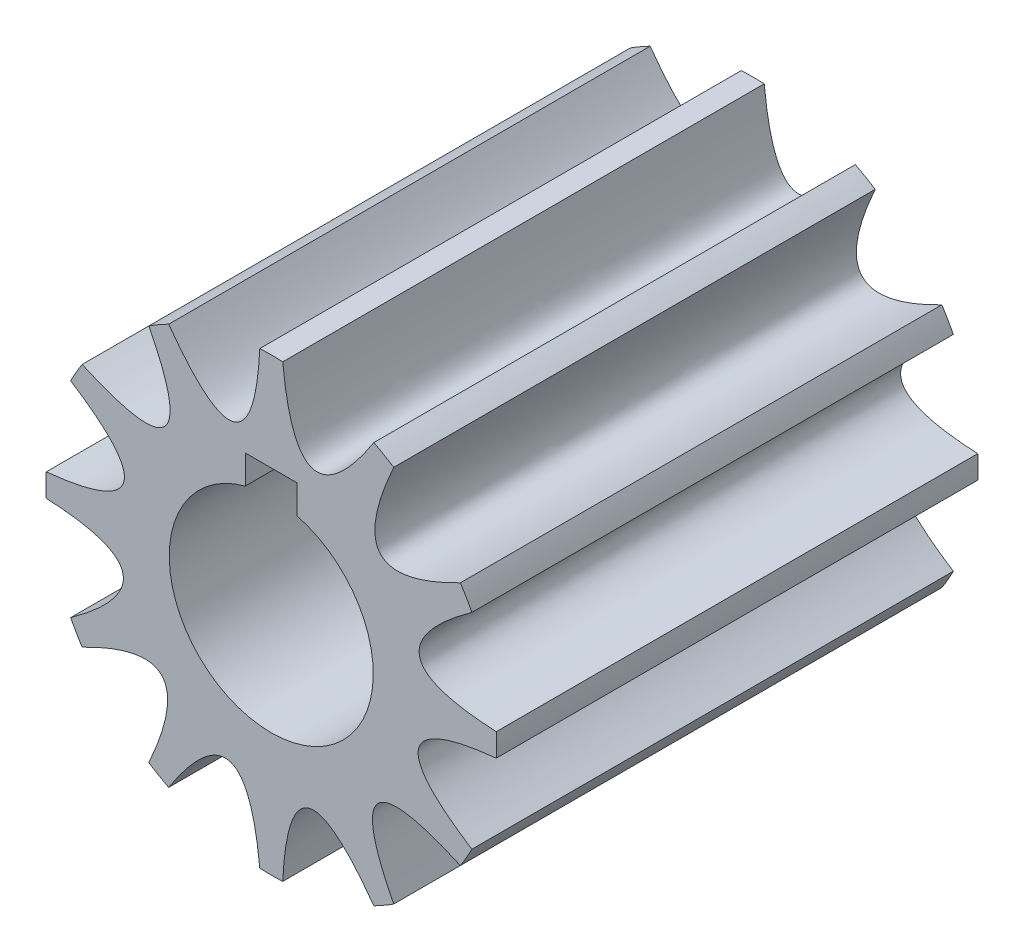
ISO-10303-21;
HEADER;
FILE_DESCRIPTION(('STEP AP214'),'2;1');
FILE_NAME('part.step','',(''),(''),'','','');
FILE_SCHEMA(('AUTOMOTIVE_DESIGN { 1 0 10303 214 1 1 1 1 }'));
ENDSEC;
DATA;
#1=APPLICATION_CONTEXT('core data for automotive mechanical design processes');
#2=APPLICATION_PROTOCOL_DEFINITION('international standard','automotive_design',2000,#1);
#3=PRODUCT_CONTEXT('',#1,'mechanical');
#4=PRODUCT('Part','Part','',(#3));
#5=PRODUCT_RELATED_PRODUCT_CATEGORY('part','',(#4));
#6=PRODUCT_DEFINITION_FORMATION('','',#4);
#7=PRODUCT_DEFINITION_CONTEXT('part definition',#1,'design');
#8=PRODUCT_DEFINITION('design','',#6,#7);
#9=PRODUCT_DEFINITION_SHAPE('','',#8);
#10=(LENGTH_UNIT() NAMED_UNIT(*) SI_UNIT(.MILLI.,.METRE.));
#11=(NAMED_UNIT(*) PLANE_ANGLE_UNIT() SI_UNIT($,.RADIAN.));
#12=(NAMED_UNIT(*) SI_UNIT($,.STERADIAN.) SOLID_ANGLE_UNIT());
#13=UNCERTAINTY_MEASURE_WITH_UNIT(LENGTH_MEASURE(1.E-05),#10,'distance_accuracy_value','');
#14=(GEOMETRIC_REPRESENTATION_CONTEXT(3) GLOBAL_UNCERTAINTY_ASSIGNED_CONTEXT((#13)) GLOBAL_UNIT_ASSIGNED_CONTEXT((#10,
#11,#12)) REPRESENTATION_CONTEXT('',''));
#15=CARTESIAN_POINT('',(0.,0.,0.));
#16=DIRECTION('',(0.,0.,1.));
#17=DIRECTION('',(1.,0.,0.));
#18=AXIS2_PLACEMENT_3D('',#15,#16,#17);
#19=CARTESIAN_POINT('',(48.4604558894753,203.448732204864,9.4996));
#20=DIRECTION('',(0.,0.,1.));
#21=DIRECTION('',(-0.230440532713317,-0.973086409771919,0.));
#22=AXIS2_PLACEMENT_3D('',#19,#20,#21);
#23=ELLIPSE('',#22,203.101376588858,11.5476272630597);
#24=DIRECTION('',(0.,0.,-1.));
#25=VECTOR('',#24,1.);
#26=SURFACE_OF_LINEAR_EXTRUSION('',#23,#25);
#27=CARTESIAN_POINT('',(48.4604558894753,203.448732204864,-9.4996));
#28=DIRECTION('',(0.,0.,1.));
#29=DIRECTION('',(-0.230440532713317,-0.973086409771919,0.));
#30=AXIS2_PLACEMENT_3D('',#27,#28,#29);
#31=ELLIPSE('',#30,203.101376588858,11.5476272630597);
#32=CARTESIAN_POINT('',(0.453195017414437,8.87844091143134,-9.4996));
#33=VERTEX_POINT('',#32);
#34=CARTESIAN_POINT('',(4.04674207822592,7.91555287445571,-9.4996));
#35=VERTEX_POINT('',#34);
#36=EDGE_CURVE('E253',#33,#35,#31,.T.);
#37=ORIENTED_EDGE('',*,*,#36,.F.);
#38=DIRECTION('',(0.,0.,-1.));
#39=VECTOR('',#38,1.);
#40=CARTESIAN_POINT('',(0.453195017414437,8.87844091143134,9.4996));
#41=LINE('',#40,#39);
#42=CARTESIAN_POINT('',(0.453195017414437,8.87844091143134,9.4996));
#43=VERTEX_POINT('',#42);
#44=EDGE_CURVE('E11',#43,#33,#41,.T.);
#45=ORIENTED_EDGE('',*,*,#44,.F.);
#46=CARTESIAN_POINT('',(4.04674207822592,7.91555287445571,9.4996));
#47=VERTEX_POINT('',#46);
#48=EDGE_CURVE('E256',#43,#47,#23,.T.);
#49=ORIENTED_EDGE('',*,*,#48,.T.);
#50=DIRECTION('',(0.,0.,-1.));
#51=VECTOR('',#50,1.);
#52=CARTESIAN_POINT('',(4.04674207822592,7.91555287445571,9.4996));
#53=LINE('',#52,#51);
#54=EDGE_CURVE('E38',#47,#35,#53,.T.);
#55=ORIENTED_EDGE('',*,*,#54,.T.);
#56=EDGE_LOOP('',(#37,#45,#49,#55));
#57=FACE_BOUND('',#56,.T.);
#58=ADVANCED_FACE('F34',(#57),#26,.T.);
#59=CARTESIAN_POINT('',(9.12772461780786E-10,-4.07165100246853E-09,9.4996));
#60=DIRECTION('',(0.,0.,-1.));
#61=DIRECTION('',(-1.,0.,0.));
#62=AXIS2_PLACEMENT_3D('',#59,#60,#61);
#63=CYLINDRICAL_SURFACE('',#62,8.88999993324295);
#64=CARTESIAN_POINT('',(9.12772461780786E-10,-4.07165100246853E-09,-9.4996));
#65=DIRECTION('',(0.,0.,-1.));
#66=DIRECTION('',(-1.,0.,0.));
#67=AXIS2_PLACEMENT_3D('',#64,#65,#66);
#68=CIRCLE('',#67,8.88999993324295);
#69=CARTESIAN_POINT('',(-0.453194988001726,8.87844091283965,-9.4996));
#70=VERTEX_POINT('',#69);
#71=EDGE_CURVE('E261',#70,#33,#68,.T.);
#72=ORIENTED_EDGE('',*,*,#71,.F.);
#73=DIRECTION('',(0.,0.,-1.));
#74=VECTOR('',#73,1.);
#75=CARTESIAN_POINT('',(-0.453194988001726,8.87844091283965,9.4996));
#76=LINE('',#75,#74);
#77=CARTESIAN_POINT('',(-0.453194988001726,8.87844091283965,9.4996));
#78=VERTEX_POINT('',#77);
#79=EDGE_CURVE('E43',#78,#70,#76,.T.);
#80=ORIENTED_EDGE('',*,*,#79,.F.);
#81=CARTESIAN_POINT('',(9.12772461780786E-10,-4.07165100246853E-09,9.4996));
#82=DIRECTION('',(0.,0.,-1.));
#83=DIRECTION('',(-1.,0.,0.));
#84=AXIS2_PLACEMENT_3D('',#81,#82,#83);
#85=CIRCLE('',#84,8.88999993324295);
#86=EDGE_CURVE('E355',#78,#43,#85,.T.);
#87=ORIENTED_EDGE('',*,*,#86,.T.);
#88=ORIENTED_EDGE('',*,*,#44,.T.);
#89=EDGE_LOOP('',(#72,#80,#87,#88));
#90=FACE_BOUND('',#89,.T.);
#91=ADVANCED_FACE('F287',(#90),#63,.T.);
#92=CARTESIAN_POINT('',(-59.7564548879514,200.422251397141,9.4996));
#93=DIRECTION('',(0.,0.,1.));
#94=DIRECTION('',(0.286975844333206,-0.95793781884277,0.));
#95=AXIS2_PLACEMENT_3D('',#92,#93,#94);
#96=ELLIPSE('',#95,203.10164036931,11.5476347448491);
#97=DIRECTION('',(0.,0.,-1.));
#98=VECTOR('',#97,1.);
#99=SURFACE_OF_LINEAR_EXTRUSION('',#96,#98);
#100=CARTESIAN_POINT('',(-59.7564548879514,200.422251397141,-9.4996));
#101=DIRECTION('',(0.,0.,1.));
#102=DIRECTION('',(0.286975844333206,-0.95793781884277,0.));
#103=AXIS2_PLACEMENT_3D('',#100,#101,#102);
#104=ELLIPSE('',#103,203.10164036931,11.5476347448491);
#105=CARTESIAN_POINT('',(-4.04674205967976,7.91555288300396,-9.4996));
#106=VERTEX_POINT('',#105);
#107=EDGE_CURVE('E307',#106,#70,#104,.T.);
#108=ORIENTED_EDGE('',*,*,#107,.F.);
#109=DIRECTION('',(0.,0.,-1.));
#110=VECTOR('',#109,1.);
#111=CARTESIAN_POINT('',(-4.04674205967976,7.91555288300396,9.4996));
#112=LINE('',#111,#110);
#113=CARTESIAN_POINT('',(-4.04674205967976,7.91555288300396,9.4996));
#114=VERTEX_POINT('',#113);
#115=EDGE_CURVE('E314',#114,#106,#112,.T.);
#116=ORIENTED_EDGE('',*,*,#115,.F.);
#117=EDGE_CURVE('E357',#114,#78,#96,.T.);
#118=ORIENTED_EDGE('',*,*,#117,.T.);
#119=ORIENTED_EDGE('',*,*,#79,.T.);
#120=EDGE_LOOP('',(#108,#116,#118,#119));
#121=FACE_BOUND('',#120,.T.);
#122=ADVANCED_FACE('F292',(#121),#99,.T.);
#123=CARTESIAN_POINT('',(9.12772461780786E-10,-4.07165100246853E-09,9.4996));
#124=DIRECTION('',(0.,0.,-1.));
#125=DIRECTION('',(-1.,0.,0.));
#126=AXIS2_PLACEMENT_3D('',#123,#124,#125);
#127=CYLINDRICAL_SURFACE('',#126,8.88999993324296);
#128=CARTESIAN_POINT('',(9.12772461780786E-10,-4.07165100246853E-09,-9.4996));
#129=DIRECTION('',(0.,0.,-1.));
#130=DIRECTION('',(-1.,0.,0.));
#131=AXIS2_PLACEMENT_3D('',#128,#129,#130);
#132=CIRCLE('',#131,8.88999993324296);
#133=CARTESIAN_POINT('',(-4.83169883081061,7.46235788151553,-9.4996));
#134=VERTEX_POINT('',#133);
#135=EDGE_CURVE('E309',#134,#106,#132,.T.);
#136=ORIENTED_EDGE('',*,*,#135,.F.);
#137=DIRECTION('',(0.,0.,-1.));
#138=VECTOR('',#137,1.);
#139=CARTESIAN_POINT('',(-4.83169883081061,7.46235788151553,9.4996));
#140=LINE('',#139,#138);
#141=CARTESIAN_POINT('',(-4.83169883081061,7.46235788151553,9.4996));
#142=VERTEX_POINT('',#141);
#143=EDGE_CURVE('E316',#142,#134,#140,.T.);
#144=ORIENTED_EDGE('',*,*,#143,.F.);
#145=CARTESIAN_POINT('',(9.12772461780786E-10,-4.07165100246853E-09,9.4996));
#146=DIRECTION('',(0.,0.,-1.));
#147=DIRECTION('',(-1.,0.,0.));
#148=AXIS2_PLACEMENT_3D('',#145,#146,#147);
#149=CIRCLE('',#148,8.88999993324296);
#150=EDGE_CURVE('E361',#142,#114,#149,.T.);
#151=ORIENTED_EDGE('',*,*,#150,.T.);
#152=ORIENTED_EDGE('',*,*,#115,.T.);
#153=EDGE_LOOP('',(#136,#144,#151,#152));
#154=FACE_BOUND('',#153,.T.);
#155=ADVANCED_FACE('F426',(#154),#127,.T.);
#156=CARTESIAN_POINT('',(-151.961676407504,143.692478593525,9.4996));
#157=DIRECTION('',(0.,0.,1.));
#158=DIRECTION('',(0.727497283751305,-0.686110561159404,0.));
#159=AXIS2_PLACEMENT_3D('',#156,#157,#158);
#160=ELLIPSE('',#159,203.101560866742,11.5476324964072);
#161=DIRECTION('',(0.,0.,-1.));
#162=VECTOR('',#161,1.);
#163=SURFACE_OF_LINEAR_EXTRUSION('',#160,#162);
#164=CARTESIAN_POINT('',(-151.961676407504,143.692478593525,-9.4996));
#165=DIRECTION('',(0.,0.,1.));
#166=DIRECTION('',(0.727497283751305,-0.686110561159404,0.));
#167=AXIS2_PLACEMENT_3D('',#164,#165,#166);
#168=ELLIPSE('',#167,203.101560866742,11.5476324964072);
#169=CARTESIAN_POINT('',(-7.46235786966115,4.8316988508388,-9.4996));
#170=VERTEX_POINT('',#169);
#171=EDGE_CURVE('E421',#170,#134,#168,.T.);
#172=ORIENTED_EDGE('',*,*,#171,.F.);
#173=DIRECTION('',(0.,0.,-1.));
#174=VECTOR('',#173,1.);
#175=CARTESIAN_POINT('',(-7.46235786966115,4.8316988508388,9.4996));
#176=LINE('',#175,#174);
#177=CARTESIAN_POINT('',(-7.46235786966115,4.8316988508388,9.4996));
#178=VERTEX_POINT('',#177);
#179=EDGE_CURVE('E318',#178,#170,#176,.T.);
#180=ORIENTED_EDGE('',*,*,#179,.F.);
#181=EDGE_CURVE('E532',#178,#142,#160,.T.);
#182=ORIENTED_EDGE('',*,*,#181,.T.);
#183=ORIENTED_EDGE('',*,*,#143,.T.);
#184=EDGE_LOOP('',(#172,#180,#182,#183));
#185=FACE_BOUND('',#184,.T.);
#186=ADVANCED_FACE('F531',(#185),#163,.T.);
#187=CARTESIAN_POINT('',(9.12772461780786E-10,-4.07165100246853E-09,9.4996));
#188=DIRECTION('',(0.,0.,-1.));
#189=DIRECTION('',(-1.,0.,0.));
#190=AXIS2_PLACEMENT_3D('',#187,#188,#189);
#191=CYLINDRICAL_SURFACE('',#190,8.88999993324295);
#192=CARTESIAN_POINT('',(9.12772461780786E-10,-4.07165100246853E-09,-9.4996));
#193=DIRECTION('',(0.,0.,-1.));
#194=DIRECTION('',(-1.,0.,0.));
#195=AXIS2_PLACEMENT_3D('',#192,#193,#194);
#196=CIRCLE('',#195,8.88999993324295);
#197=CARTESIAN_POINT('',(-7.91555287358883,4.04674208111627,-9.4996));
#198=VERTEX_POINT('',#197);
#199=EDGE_CURVE('E418',#198,#170,#196,.T.);
#200=ORIENTED_EDGE('',*,*,#199,.F.);
#201=DIRECTION('',(0.,0.,-1.));
#202=VECTOR('',#201,1.);
#203=CARTESIAN_POINT('',(-7.91555287358883,4.04674208111627,9.4996));
#204=LINE('',#203,#202);
#205=CARTESIAN_POINT('',(-7.91555287358883,4.04674208111627,9.4996));
#206=VERTEX_POINT('',#205);
#207=EDGE_CURVE('E320',#206,#198,#204,.T.);
#208=ORIENTED_EDGE('',*,*,#207,.F.);
#209=CARTESIAN_POINT('',(9.12772461780786E-10,-4.07165100246853E-09,9.4996));
#210=DIRECTION('',(0.,0.,-1.));
#211=DIRECTION('',(-1.,0.,0.));
#212=AXIS2_PLACEMENT_3D('',#209,#210,#211);
#213=CIRCLE('',#212,8.88999993324295);
#214=EDGE_CURVE('E527',#206,#178,#213,.T.);
#215=ORIENTED_EDGE('',*,*,#214,.T.);
#216=ORIENTED_EDGE('',*,*,#179,.T.);
#217=EDGE_LOOP('',(#200,#208,#215,#216));
#218=FACE_BOUND('',#217,.T.);
#219=ADVANCED_FACE('F526',(#218),#191,.T.);
#220=CARTESIAN_POINT('',(-203.448958796358,48.460510323592,9.4996));
#221=DIRECTION('',(0.,0.,1.));
#222=DIRECTION('',(0.97308640890236,-0.230440536385222,0.));
#223=AXIS2_PLACEMENT_3D('',#220,#221,#222);
#224=ELLIPSE('',#223,203.10160962351,11.5476338753159);
#225=DIRECTION('',(0.,0.,-1.));
#226=VECTOR('',#225,1.);
#227=SURFACE_OF_LINEAR_EXTRUSION('',#224,#226);
#228=CARTESIAN_POINT('',(-203.448958796358,48.460510323592,-9.4996));
#229=DIRECTION('',(0.,0.,1.));
#230=DIRECTION('',(0.97308640890236,-0.230440536385222,0.));
#231=AXIS2_PLACEMENT_3D('',#228,#229,#230);
#232=ELLIPSE('',#231,203.10160962351,11.5476338753159);
#233=CARTESIAN_POINT('',(-8.87844091459023,0.453195012430017,-9.4996));
#234=VERTEX_POINT('',#233);
#235=EDGE_CURVE('E415',#234,#198,#232,.T.);
#236=ORIENTED_EDGE('',*,*,#235,.F.);
#237=DIRECTION('',(0.,0.,-1.));
#238=VECTOR('',#237,1.);
#239=CARTESIAN_POINT('',(-8.87844091459023,0.453195012430017,9.4996));
#240=LINE('',#239,#238);
#241=CARTESIAN_POINT('',(-8.87844091459023,0.453195012430017,9.4996));
#242=VERTEX_POINT('',#241);
#243=EDGE_CURVE('E322',#242,#234,#240,.T.);
#244=ORIENTED_EDGE('',*,*,#243,.F.);
#245=EDGE_CURVE('E522',#242,#206,#224,.T.);
#246=ORIENTED_EDGE('',*,*,#245,.T.);
#247=ORIENTED_EDGE('',*,*,#207,.T.);
#248=EDGE_LOOP('',(#236,#244,#246,#247));
#249=FACE_BOUND('',#248,.T.);
#250=ADVANCED_FACE('F520',(#249),#227,.T.);
#251=CARTESIAN_POINT('',(9.12772461780786E-10,-4.07165100246853E-09,9.4996));
#252=DIRECTION('',(0.,0.,-1.));
#253=DIRECTION('',(-1.,0.,0.));
#254=AXIS2_PLACEMENT_3D('',#251,#252,#253);
#255=CYLINDRICAL_SURFACE('',#254,8.88999993324295);
#256=CARTESIAN_POINT('',(9.12772461780786E-10,-4.07165100246853E-09,-9.4996));
#257=DIRECTION('',(0.,0.,-1.));
#258=DIRECTION('',(-1.,0.,0.));
#259=AXIS2_PLACEMENT_3D('',#256,#257,#258);
#260=CIRCLE('',#259,8.88999993324295);
#261=CARTESIAN_POINT('',(-8.87844091599846,-0.453194992986183,-9.4996));
#262=VERTEX_POINT('',#261);
#263=EDGE_CURVE('E412',#262,#234,#260,.T.);
#264=ORIENTED_EDGE('',*,*,#263,.F.);
#265=DIRECTION('',(0.,0.,-1.));
#266=VECTOR('',#265,1.);
#267=CARTESIAN_POINT('',(-8.87844091599846,-0.453194992986183,9.4996));
#268=LINE('',#267,#266);
#269=CARTESIAN_POINT('',(-8.87844091599846,-0.453194992986183,9.4996));
#270=VERTEX_POINT('',#269);
#271=EDGE_CURVE('E324',#270,#262,#268,.T.);
#272=ORIENTED_EDGE('',*,*,#271,.F.);
#273=CARTESIAN_POINT('',(9.12772461780786E-10,-4.07165100246853E-09,9.4996));
#274=DIRECTION('',(0.,0.,-1.));
#275=DIRECTION('',(-1.,0.,0.));
#276=AXIS2_PLACEMENT_3D('',#273,#274,#275);
#277=CIRCLE('',#276,8.88999993324295);
#278=EDGE_CURVE('E516',#270,#242,#277,.T.);
#279=ORIENTED_EDGE('',*,*,#278,.T.);
#280=ORIENTED_EDGE('',*,*,#243,.T.);
#281=EDGE_LOOP('',(#264,#272,#279,#280));
#282=FACE_BOUND('',#281,.T.);
#283=ADVANCED_FACE('F513',(#282),#255,.T.);
#284=CARTESIAN_POINT('',(-200.422205243426,-59.75644159166,9.4996));
#285=DIRECTION('',(0.,0.,1.));
#286=DIRECTION('',(0.957937818118767,0.28697584674996,0.));
#287=AXIS2_PLACEMENT_3D('',#284,#285,#286);
#288=ELLIPSE('',#287,203.101592337243,11.5476333864361);
#289=DIRECTION('',(0.,0.,-1.));
#290=VECTOR('',#289,1.);
#291=SURFACE_OF_LINEAR_EXTRUSION('',#288,#290);
#292=CARTESIAN_POINT('',(-200.422205243426,-59.75644159166,-9.4996));
#293=DIRECTION('',(0.,0.,1.));
#294=DIRECTION('',(0.957937818118767,0.28697584674996,0.));
#295=AXIS2_PLACEMENT_3D('',#292,#293,#294);
#296=ELLIPSE('',#295,203.101592337243,11.5476333864361);
#297=CARTESIAN_POINT('',(-7.91555288616282,-4.04674206466421,-9.4996));
#298=VERTEX_POINT('',#297);
#299=EDGE_CURVE('E409',#298,#262,#296,.T.);
#300=ORIENTED_EDGE('',*,*,#299,.F.);
#301=DIRECTION('',(0.,0.,-1.));
#302=VECTOR('',#301,1.);
#303=CARTESIAN_POINT('',(-7.91555288616282,-4.04674206466421,9.4996));
#304=LINE('',#303,#302);
#305=CARTESIAN_POINT('',(-7.91555288616282,-4.04674206466421,9.4996));
#306=VERTEX_POINT('',#305);
#307=EDGE_CURVE('E326',#306,#298,#304,.T.);
#308=ORIENTED_EDGE('',*,*,#307,.F.);
#309=EDGE_CURVE('E550',#306,#270,#288,.T.);
#310=ORIENTED_EDGE('',*,*,#309,.T.);
#311=ORIENTED_EDGE('',*,*,#271,.T.);
#312=EDGE_LOOP('',(#300,#308,#310,#311));
#313=FACE_BOUND('',#312,.T.);
#314=ADVANCED_FACE('F509',(#313),#291,.T.);
#315=CARTESIAN_POINT('',(9.12772461780786E-10,-4.07165100246853E-09,9.4996));
#316=DIRECTION('',(0.,0.,-1.));
#317=DIRECTION('',(-1.,0.,0.));
#318=AXIS2_PLACEMENT_3D('',#315,#316,#317);
#319=CYLINDRICAL_SURFACE('',#318,8.88999993324294);
#320=CARTESIAN_POINT('',(9.12772461780786E-10,-4.07165100246853E-09,-9.4996));
#321=DIRECTION('',(0.,0.,-1.));
#322=DIRECTION('',(-1.,0.,0.));
#323=AXIS2_PLACEMENT_3D('',#320,#321,#322);
#324=CIRCLE('',#323,8.88999993324294);
#325=CARTESIAN_POINT('',(-7.46235788467428,-4.83169883579507,-9.4996));
#326=VERTEX_POINT('',#325);
#327=EDGE_CURVE('E406',#326,#298,#324,.T.);
#328=ORIENTED_EDGE('',*,*,#327,.F.);
#329=DIRECTION('',(0.,0.,-1.));
#330=VECTOR('',#329,1.);
#331=CARTESIAN_POINT('',(-7.46235788467428,-4.83169883579507,9.4996));
#332=LINE('',#331,#330);
#333=CARTESIAN_POINT('',(-7.46235788467428,-4.83169883579507,9.4996));
#334=VERTEX_POINT('',#333);
#335=EDGE_CURVE('E328',#334,#326,#332,.T.);
#336=ORIENTED_EDGE('',*,*,#335,.F.);
#337=CARTESIAN_POINT('',(9.12772461780786E-10,-4.07165100246853E-09,9.4996));
#338=DIRECTION('',(0.,0.,-1.));
#339=DIRECTION('',(-1.,0.,0.));
#340=AXIS2_PLACEMENT_3D('',#337,#338,#339);
#341=CIRCLE('',#340,8.88999993324294);
#342=EDGE_CURVE('E505',#334,#306,#341,.T.);
#343=ORIENTED_EDGE('',*,*,#342,.T.);
#344=ORIENTED_EDGE('',*,*,#307,.T.);
#345=EDGE_LOOP('',(#328,#336,#343,#344));
#346=FACE_BOUND('',#345,.T.);
#347=ADVANCED_FACE('F503',(#346),#319,.T.);
#348=CARTESIAN_POINT('',(-143.692499932456,-151.961698564761,9.4996));
#349=DIRECTION('',(0.,0.,1.));
#350=DIRECTION('',(-0.686110562334691,-0.72749728264288,0.));
#351=AXIS2_PLACEMENT_3D('',#348,#349,#350);
#352=ELLIPSE('',#351,203.101591620843,11.5476333661757);
#353=DIRECTION('',(0.,0.,-1.));
#354=VECTOR('',#353,1.);
#355=SURFACE_OF_LINEAR_EXTRUSION('',#352,#354);
#356=CARTESIAN_POINT('',(-143.692499932456,-151.961698564761,-9.4996));
#357=DIRECTION('',(0.,0.,1.));
#358=DIRECTION('',(-0.686110562334691,-0.72749728264288,0.));
#359=AXIS2_PLACEMENT_3D('',#356,#357,#358);
#360=ELLIPSE('',#359,203.101591620843,11.5476333661757);
#361=CARTESIAN_POINT('',(-4.83169885399765,-7.4623578746456,-9.4996));
#362=VERTEX_POINT('',#361);
#363=EDGE_CURVE('E403',#362,#326,#360,.T.);
#364=ORIENTED_EDGE('',*,*,#363,.F.);
#365=DIRECTION('',(0.,0.,-1.));
#366=VECTOR('',#365,1.);
#367=CARTESIAN_POINT('',(-4.83169885399765,-7.4623578746456,9.4996));
#368=LINE('',#367,#366);
#369=CARTESIAN_POINT('',(-4.83169885399765,-7.4623578746456,9.4996));
#370=VERTEX_POINT('',#369);
#371=EDGE_CURVE('E330',#370,#362,#368,.T.);
#372=ORIENTED_EDGE('',*,*,#371,.F.);
#373=EDGE_CURVE('E499',#370,#334,#352,.T.);
#374=ORIENTED_EDGE('',*,*,#373,.T.);
#375=ORIENTED_EDGE('',*,*,#335,.T.);
#376=EDGE_LOOP('',(#364,#372,#374,#375));
#377=FACE_BOUND('',#376,.T.);
#378=ADVANCED_FACE('F496',(#377),#355,.T.);
#379=CARTESIAN_POINT('',(9.12772461780786E-10,-4.07165100246853E-09,9.4996));
#380=DIRECTION('',(0.,0.,-1.));
#381=DIRECTION('',(-1.,0.,0.));
#382=AXIS2_PLACEMENT_3D('',#379,#380,#381);
#383=CYLINDRICAL_SURFACE('',#382,8.88999993324295);
#384=CARTESIAN_POINT('',(9.12772461780786E-10,-4.07165100246853E-09,-9.4996));
#385=DIRECTION('',(0.,0.,-1.));
#386=DIRECTION('',(-1.,0.,0.));
#387=AXIS2_PLACEMENT_3D('',#384,#385,#386);
#388=CIRCLE('',#387,8.88999993324295);
#389=CARTESIAN_POINT('',(-4.04674208427507,-7.91555287857329,-9.4996));
#390=VERTEX_POINT('',#389);
#391=EDGE_CURVE('E400',#390,#362,#388,.T.);
#392=ORIENTED_EDGE('',*,*,#391,.F.);
#393=DIRECTION('',(0.,0.,-1.));
#394=VECTOR('',#393,1.);
#395=CARTESIAN_POINT('',(-4.04674208427507,-7.91555287857329,9.4996));
#396=LINE('',#395,#394);
#397=CARTESIAN_POINT('',(-4.04674208427507,-7.91555287857329,9.4996));
#398=VERTEX_POINT('',#397);
#399=EDGE_CURVE('E332',#398,#390,#396,.T.);
#400=ORIENTED_EDGE('',*,*,#399,.F.);
#401=CARTESIAN_POINT('',(9.12772461780786E-10,-4.07165100246853E-09,9.4996));
#402=DIRECTION('',(0.,0.,-1.));
#403=DIRECTION('',(-1.,0.,0.));
#404=AXIS2_PLACEMENT_3D('',#401,#402,#403);
#405=CIRCLE('',#404,8.88999993324295);
#406=EDGE_CURVE('E563',#398,#370,#405,.T.);
#407=ORIENTED_EDGE('',*,*,#406,.T.);
#408=ORIENTED_EDGE('',*,*,#371,.T.);
#409=EDGE_LOOP('',(#392,#400,#407,#408));
#410=FACE_BOUND('',#409,.T.);
#411=ADVANCED_FACE('F492',(#410),#383,.T.);
#412=CARTESIAN_POINT('',(-48.4605160439241,-203.448981861526,9.4996));
#413=DIRECTION('',(0.,0.,1.));
#414=DIRECTION('',(-0.230440537599297,-0.97308640861485,0.));
#415=AXIS2_PLACEMENT_3D('',#412,#413,#414);
#416=ELLIPSE('',#415,203.101633380286,11.5476345471901);
#417=DIRECTION('',(0.,0.,-1.));
#418=VECTOR('',#417,1.);
#419=SURFACE_OF_LINEAR_EXTRUSION('',#416,#418);
#420=CARTESIAN_POINT('',(-48.4605160439241,-203.448981861526,-9.4996));
#421=DIRECTION('',(0.,0.,1.));
#422=DIRECTION('',(-0.230440537599297,-0.97308640861485,0.));
#423=AXIS2_PLACEMENT_3D('',#420,#421,#422);
#424=ELLIPSE('',#423,203.101633380286,11.5476345471901);
#425=CARTESIAN_POINT('',(-0.453195015588863,-8.87844091957467,-9.4996));
#426=VERTEX_POINT('',#425);
#427=EDGE_CURVE('E397',#426,#390,#424,.T.);
#428=ORIENTED_EDGE('',*,*,#427,.F.);
#429=DIRECTION('',(0.,0.,-1.));
#430=VECTOR('',#429,1.);
#431=CARTESIAN_POINT('',(-0.453195015588863,-8.87844091957467,9.4996));
#432=LINE('',#431,#430);
#433=CARTESIAN_POINT('',(-0.453195015588863,-8.87844091957467,9.4996));
#434=VERTEX_POINT('',#433);
#435=EDGE_CURVE('E334',#434,#426,#432,.T.);
#436=ORIENTED_EDGE('',*,*,#435,.F.);
#437=EDGE_CURVE('E488',#434,#398,#416,.T.);
#438=ORIENTED_EDGE('',*,*,#437,.T.);
#439=ORIENTED_EDGE('',*,*,#399,.T.);
#440=EDGE_LOOP('',(#428,#436,#438,#439));
#441=FACE_BOUND('',#440,.T.);
#442=ADVANCED_FACE('F486',(#441),#419,.T.);
#443=CARTESIAN_POINT('',(9.12772461780786E-10,-4.07165100246853E-09,9.4996));
#444=DIRECTION('',(0.,0.,-1.));
#445=DIRECTION('',(-1.,0.,0.));
#446=AXIS2_PLACEMENT_3D('',#443,#444,#445);
#447=CYLINDRICAL_SURFACE('',#446,8.88999993324297);
#448=CARTESIAN_POINT('',(9.12772461780786E-10,-4.07165100246853E-09,-9.4996));
#449=DIRECTION('',(0.,0.,-1.));
#450=DIRECTION('',(-1.,0.,0.));
#451=AXIS2_PLACEMENT_3D('',#448,#449,#450);
#452=CIRCLE('',#451,8.88999993324297);
#453=CARTESIAN_POINT('',(0.453194989827307,-8.87844092098297,-9.4996));
#454=VERTEX_POINT('',#453);
#455=EDGE_CURVE('E394',#454,#426,#452,.T.);
#456=ORIENTED_EDGE('',*,*,#455,.F.);
#457=DIRECTION('',(0.,0.,-1.));
#458=VECTOR('',#457,1.);
#459=CARTESIAN_POINT('',(0.453194989827307,-8.87844092098297,9.4996));
#460=LINE('',#459,#458);
#461=CARTESIAN_POINT('',(0.453194989827307,-8.87844092098297,9.4996));
#462=VERTEX_POINT('',#461);
#463=EDGE_CURVE('E336',#462,#454,#460,.T.);
#464=ORIENTED_EDGE('',*,*,#463,.F.);
#465=CARTESIAN_POINT('',(9.12772461780786E-10,-4.07165100246853E-09,9.4996));
#466=DIRECTION('',(0.,0.,-1.));
#467=DIRECTION('',(-1.,0.,0.));
#468=AXIS2_PLACEMENT_3D('',#465,#466,#467);
#469=CIRCLE('',#468,8.88999993324297);
#470=EDGE_CURVE('E482',#462,#434,#469,.T.);
#471=ORIENTED_EDGE('',*,*,#470,.T.);
#472=ORIENTED_EDGE('',*,*,#435,.T.);
#473=EDGE_LOOP('',(#456,#464,#471,#472));
#474=FACE_BOUND('',#473,.T.);
#475=ADVANCED_FACE('F479',(#474),#447,.T.);
#476=CARTESIAN_POINT('',(59.7564369931577,-200.422189302031,9.4996));
#477=DIRECTION('',(0.,0.,1.));
#478=DIRECTION('',(0.286975847584956,-0.957937817868621,0.));
#479=AXIS2_PLACEMENT_3D('',#476,#477,#478);
#480=ELLIPSE('',#479,203.10157574302,11.5476329171286);
#481=DIRECTION('',(0.,0.,-1.));
#482=VECTOR('',#481,1.);
#483=SURFACE_OF_LINEAR_EXTRUSION('',#480,#482);
#484=CARTESIAN_POINT('',(59.7564369931577,-200.422189302031,-9.4996));
#485=DIRECTION('',(0.,0.,1.));
#486=DIRECTION('',(0.286975847584956,-0.957937817868621,0.));
#487=AXIS2_PLACEMENT_3D('',#484,#485,#486);
#488=ELLIPSE('',#487,203.10157574302,11.5476329171286);
#489=CARTESIAN_POINT('',(4.04674206150534,-7.91555289114722,-9.4996));
#490=VERTEX_POINT('',#489);
#491=EDGE_CURVE('E391',#490,#454,#488,.T.);
#492=ORIENTED_EDGE('',*,*,#491,.F.);
#493=DIRECTION('',(0.,0.,-1.));
#494=VECTOR('',#493,1.);
#495=CARTESIAN_POINT('',(4.04674206150534,-7.91555289114722,9.4996));
#496=LINE('',#495,#494);
#497=CARTESIAN_POINT('',(4.04674206150534,-7.91555289114722,9.4996));
#498=VERTEX_POINT('',#497);
#499=EDGE_CURVE('E338',#498,#490,#496,.T.);
#500=ORIENTED_EDGE('',*,*,#499,.F.);
#501=EDGE_CURVE('E575',#498,#462,#480,.T.);
#502=ORIENTED_EDGE('',*,*,#501,.T.);
#503=ORIENTED_EDGE('',*,*,#463,.T.);
#504=EDGE_LOOP('',(#492,#500,#502,#503));
#505=FACE_BOUND('',#504,.T.);
#506=ADVANCED_FACE('F475',(#505),#483,.T.);
#507=CARTESIAN_POINT('',(9.12772461780786E-10,-4.07165100246853E-09,9.4996));
#508=DIRECTION('',(0.,0.,-1.));
#509=DIRECTION('',(-1.,0.,0.));
#510=AXIS2_PLACEMENT_3D('',#507,#508,#509);
#511=CYLINDRICAL_SURFACE('',#510,8.88999993324294);
#512=CARTESIAN_POINT('',(9.12772461780786E-10,-4.07165100246853E-09,-9.4996));
#513=DIRECTION('',(0.,0.,-1.));
#514=DIRECTION('',(-1.,0.,0.));
#515=AXIS2_PLACEMENT_3D('',#512,#513,#514);
#516=CIRCLE('',#515,8.88999993324294);
#517=CARTESIAN_POINT('',(4.83169883263626,-7.46235788965868,-9.4996));
#518=VERTEX_POINT('',#517);
#519=EDGE_CURVE('E388',#518,#490,#516,.T.);
#520=ORIENTED_EDGE('',*,*,#519,.F.);
#521=DIRECTION('',(0.,0.,-1.));
#522=VECTOR('',#521,1.);
#523=CARTESIAN_POINT('',(4.83169883263626,-7.46235788965868,9.4996));
#524=LINE('',#523,#522);
#525=CARTESIAN_POINT('',(4.83169883263626,-7.46235788965868,9.4996));
#526=VERTEX_POINT('',#525);
#527=EDGE_CURVE('E340',#526,#518,#524,.T.);
#528=ORIENTED_EDGE('',*,*,#527,.F.);
#529=CARTESIAN_POINT('',(9.12772461780786E-10,-4.07165100246853E-09,9.4996));
#530=DIRECTION('',(0.,0.,-1.));
#531=DIRECTION('',(-1.,0.,0.));
#532=AXIS2_PLACEMENT_3D('',#529,#530,#531);
#533=CIRCLE('',#532,8.88999993324294);
#534=EDGE_CURVE('E471',#526,#498,#533,.T.);
#535=ORIENTED_EDGE('',*,*,#534,.T.);
#536=ORIENTED_EDGE('',*,*,#499,.T.);
#537=EDGE_LOOP('',(#520,#528,#535,#536));
#538=FACE_BOUND('',#537,.T.);
#539=ADVANCED_FACE('F469',(#538),#511,.T.);
#540=CARTESIAN_POINT('',(151.961718141521,-143.692518795393,9.4996));
#541=DIRECTION('',(0.,0.,1.));
#542=DIRECTION('',(0.727497281663865,-0.686110563372761,0.));
#543=AXIS2_PLACEMENT_3D('',#540,#541,#542);
#544=ELLIPSE('',#543,203.101618803543,11.5476341349392);
#545=DIRECTION('',(0.,0.,-1.));
#546=VECTOR('',#545,1.);
#547=SURFACE_OF_LINEAR_EXTRUSION('',#544,#546);
#548=CARTESIAN_POINT('',(151.961718141521,-143.692518795393,-9.4996));
#549=DIRECTION('',(0.,0.,1.));
#550=DIRECTION('',(0.727497281663865,-0.686110563372761,0.));
#551=AXIS2_PLACEMENT_3D('',#548,#549,#550);
#552=ELLIPSE('',#551,203.101618803543,11.5476341349392);
#553=CARTESIAN_POINT('',(7.46235787148672,-4.83169885898208,-9.4996));
#554=VERTEX_POINT('',#553);
#555=EDGE_CURVE('E385',#554,#518,#552,.T.);
#556=ORIENTED_EDGE('',*,*,#555,.F.);
#557=DIRECTION('',(0.,0.,-1.));
#558=VECTOR('',#557,1.);
#559=CARTESIAN_POINT('',(7.46235787148672,-4.83169885898208,9.4996));
#560=LINE('',#559,#558);
#561=CARTESIAN_POINT('',(7.46235787148672,-4.83169885898208,9.4996));
#562=VERTEX_POINT('',#561);
#563=EDGE_CURVE('E342',#562,#554,#560,.T.);
#564=ORIENTED_EDGE('',*,*,#563,.F.);
#565=EDGE_CURVE('E465',#562,#526,#544,.T.);
#566=ORIENTED_EDGE('',*,*,#565,.T.);
#567=ORIENTED_EDGE('',*,*,#527,.T.);
#568=EDGE_LOOP('',(#556,#564,#566,#567));
#569=FACE_BOUND('',#568,.T.);
#570=ADVANCED_FACE('F462',(#569),#547,.T.);
#571=CARTESIAN_POINT('',(9.12772461780786E-10,-4.07165100246853E-09,9.4996));
#572=DIRECTION('',(0.,0.,-1.));
#573=DIRECTION('',(-1.,0.,0.));
#574=AXIS2_PLACEMENT_3D('',#571,#572,#573);
#575=CYLINDRICAL_SURFACE('',#574,8.88999993324295);
#576=CARTESIAN_POINT('',(9.12772461780786E-10,-4.07165100246853E-09,-9.4996));
#577=DIRECTION('',(0.,0.,-1.));
#578=DIRECTION('',(-1.,0.,0.));
#579=AXIS2_PLACEMENT_3D('',#576,#577,#578);
#580=CIRCLE('',#579,8.88999993324295);
#581=CARTESIAN_POINT('',(7.91555287541446,-4.04674208925947,-9.4996));
#582=VERTEX_POINT('',#581);
#583=EDGE_CURVE('E382',#582,#554,#580,.T.);
#584=ORIENTED_EDGE('',*,*,#583,.F.);
#585=DIRECTION('',(0.,0.,-1.));
#586=VECTOR('',#585,1.);
#587=CARTESIAN_POINT('',(7.91555287541446,-4.04674208925947,9.4996));
#588=LINE('',#587,#586);
#589=CARTESIAN_POINT('',(7.91555287541446,-4.04674208925947,9.4996));
#590=VERTEX_POINT('',#589);
#591=EDGE_CURVE('E344',#590,#582,#588,.T.);
#592=ORIENTED_EDGE('',*,*,#591,.F.);
#593=CARTESIAN_POINT('',(9.12772461780786E-10,-4.07165100246853E-09,9.4996));
#594=DIRECTION('',(0.,0.,-1.));
#595=DIRECTION('',(-1.,0.,0.));
#596=AXIS2_PLACEMENT_3D('',#593,#594,#595);
#597=CIRCLE('',#596,8.88999993324295);
#598=EDGE_CURVE('E581',#590,#562,#597,.T.);
#599=ORIENTED_EDGE('',*,*,#598,.T.);
#600=ORIENTED_EDGE('',*,*,#563,.T.);
#601=EDGE_LOOP('',(#584,#592,#599,#600));
#602=FACE_BOUND('',#601,.T.);
#603=ADVANCED_FACE('F458',(#602),#575,.T.);
#604=CARTESIAN_POINT('',(203.448989817863,-48.4605180220952,9.4996));
#605=DIRECTION('',(0.,0.,1.));
#606=DIRECTION('',(0.973086408515796,-0.230440538017576,0.));
#607=AXIS2_PLACEMENT_3D('',#604,#605,#606);
#608=ELLIPSE('',#607,203.101641580181,11.5476347790937);
#609=DIRECTION('',(0.,0.,-1.));
#610=VECTOR('',#609,1.);
#611=SURFACE_OF_LINEAR_EXTRUSION('',#608,#610);
#612=CARTESIAN_POINT('',(203.448989817863,-48.4605180220952,-9.4996));
#613=DIRECTION('',(0.,0.,1.));
#614=DIRECTION('',(0.973086408515796,-0.230440538017576,0.));
#615=AXIS2_PLACEMENT_3D('',#612,#613,#614);
#616=ELLIPSE('',#615,203.101641580181,11.5476347790937);
#617=CARTESIAN_POINT('',(8.87844091641576,-0.453195020573293,-9.4996));
#618=VERTEX_POINT('',#617);
#619=EDGE_CURVE('E379',#618,#582,#616,.T.);
#620=ORIENTED_EDGE('',*,*,#619,.F.);
#621=DIRECTION('',(0.,0.,-1.));
#622=VECTOR('',#621,1.);
#623=CARTESIAN_POINT('',(8.87844091641576,-0.453195020573293,9.4996));
#624=LINE('',#623,#622);
#625=CARTESIAN_POINT('',(8.87844091641576,-0.453195020573293,9.4996));
#626=VERTEX_POINT('',#625);
#627=EDGE_CURVE('E346',#626,#618,#624,.T.);
#628=ORIENTED_EDGE('',*,*,#627,.F.);
#629=EDGE_CURVE('E454',#626,#590,#608,.T.);
#630=ORIENTED_EDGE('',*,*,#629,.T.);
#631=ORIENTED_EDGE('',*,*,#591,.T.);
#632=EDGE_LOOP('',(#620,#628,#630,#631));
#633=FACE_BOUND('',#632,.T.);
#634=ADVANCED_FACE('F452',(#633),#611,.T.);
#635=CARTESIAN_POINT('',(9.12772461780786E-10,-4.07165100246853E-09,9.4996));
#636=DIRECTION('',(0.,0.,-1.));
#637=DIRECTION('',(-1.,0.,0.));
#638=AXIS2_PLACEMENT_3D('',#635,#636,#637);
#639=CYLINDRICAL_SURFACE('',#638,8.88999993324294);
#640=CARTESIAN_POINT('',(9.12772461780786E-10,-4.07165100246853E-09,-9.4996));
#641=DIRECTION('',(0.,0.,-1.));
#642=DIRECTION('',(-1.,0.,0.));
#643=AXIS2_PLACEMENT_3D('',#640,#641,#642);
#644=CIRCLE('',#643,8.88999993324294);
#645=CARTESIAN_POINT('',(8.87844091782403,0.453194984842899,-9.4996));
#646=VERTEX_POINT('',#645);
#647=EDGE_CURVE('E376',#646,#618,#644,.T.);
#648=ORIENTED_EDGE('',*,*,#647,.F.);
#649=DIRECTION('',(0.,0.,-1.));
#650=VECTOR('',#649,1.);
#651=CARTESIAN_POINT('',(8.87844091782403,0.453194984842899,9.4996));
#652=LINE('',#651,#650);
#653=CARTESIAN_POINT('',(8.87844091782403,0.453194984842899,9.4996));
#654=VERTEX_POINT('',#653);
#655=EDGE_CURVE('E348',#654,#646,#652,.T.);
#656=ORIENTED_EDGE('',*,*,#655,.F.);
#657=CARTESIAN_POINT('',(9.12772461780786E-10,-4.07165100246853E-09,9.4996));
#658=DIRECTION('',(0.,0.,-1.));
#659=DIRECTION('',(-1.,0.,0.));
#660=AXIS2_PLACEMENT_3D('',#657,#658,#659);
#661=CIRCLE('',#660,8.88999993324294);
#662=EDGE_CURVE('E448',#654,#626,#661,.T.);
#663=ORIENTED_EDGE('',*,*,#662,.T.);
#664=ORIENTED_EDGE('',*,*,#627,.T.);
#665=EDGE_LOOP('',(#648,#656,#663,#664));
#666=FACE_BOUND('',#665,.T.);
#667=ADVANCED_FACE('F445',(#666),#639,.T.);
#668=CARTESIAN_POINT('',(200.422228277713,59.7564482208918,9.4996));
#669=DIRECTION('',(0.,0.,1.));
#670=DIRECTION('',(0.957937818480067,0.286975845543926,0.));
#671=AXIS2_PLACEMENT_3D('',#668,#669,#670);
#672=ELLIPSE('',#671,203.101616305429,11.5476340642896);
#673=DIRECTION('',(0.,0.,-1.));
#674=VECTOR('',#673,1.);
#675=SURFACE_OF_LINEAR_EXTRUSION('',#672,#674);
#676=CARTESIAN_POINT('',(200.422228277713,59.7564482208918,-9.4996));
#677=DIRECTION('',(0.,0.,1.));
#678=DIRECTION('',(0.957937818480067,0.286975845543926,0.));
#679=AXIS2_PLACEMENT_3D('',#676,#677,#678);
#680=ELLIPSE('',#679,203.101616305429,11.5476340642896);
#681=CARTESIAN_POINT('',(7.91555288798825,4.04674205652085,-9.4996));
#682=VERTEX_POINT('',#681);
#683=EDGE_CURVE('E373',#682,#646,#680,.T.);
#684=ORIENTED_EDGE('',*,*,#683,.F.);
#685=DIRECTION('',(0.,0.,-1.));
#686=VECTOR('',#685,1.);
#687=CARTESIAN_POINT('',(7.91555288798825,4.04674205652085,9.4996));
#688=LINE('',#687,#686);
#689=CARTESIAN_POINT('',(7.91555288798825,4.04674205652085,9.4996));
#690=VERTEX_POINT('',#689);
#691=EDGE_CURVE('E350',#690,#682,#688,.T.);
#692=ORIENTED_EDGE('',*,*,#691,.F.);
#693=EDGE_CURVE('E591',#690,#654,#672,.T.);
#694=ORIENTED_EDGE('',*,*,#693,.T.);
#695=ORIENTED_EDGE('',*,*,#655,.T.);
#696=EDGE_LOOP('',(#684,#692,#694,#695));
#697=FACE_BOUND('',#696,.T.);
#698=ADVANCED_FACE('F441',(#697),#675,.T.);
#699=CARTESIAN_POINT('',(9.12772461780786E-10,-4.07165100246853E-09,9.4996));
#700=DIRECTION('',(0.,0.,-1.));
#701=DIRECTION('',(-1.,0.,0.));
#702=AXIS2_PLACEMENT_3D('',#699,#700,#701);
#703=CYLINDRICAL_SURFACE('',#702,8.88999993324282);
#704=CARTESIAN_POINT('',(9.12772461780786E-10,-4.07165100246853E-09,-9.4996));
#705=DIRECTION('',(0.,0.,-1.));
#706=DIRECTION('',(-1.,0.,0.));
#707=AXIS2_PLACEMENT_3D('',#704,#705,#706);
#708=CIRCLE('',#707,8.88999993324282);
#709=CARTESIAN_POINT('',(7.46235787731037,4.83169884184423,-9.4996));
#710=VERTEX_POINT('',#709);
#711=EDGE_CURVE('E370',#710,#682,#708,.T.);
#712=ORIENTED_EDGE('',*,*,#711,.F.);
#713=DIRECTION('',(0.,0.,-1.));
#714=VECTOR('',#713,1.);
#715=CARTESIAN_POINT('',(7.46235787731037,4.83169884184423,9.4996));
#716=LINE('',#715,#714);
#717=CARTESIAN_POINT('',(7.46235787731037,4.83169884184423,9.4996));
#718=VERTEX_POINT('',#717);
#719=EDGE_CURVE('E352',#718,#710,#716,.T.);
#720=ORIENTED_EDGE('',*,*,#719,.F.);
#721=CARTESIAN_POINT('',(9.12772461780786E-10,-4.07165100246853E-09,9.4996));
#722=DIRECTION('',(0.,0.,-1.));
#723=DIRECTION('',(-1.,0.,0.));
#724=AXIS2_PLACEMENT_3D('',#721,#722,#723);
#725=CIRCLE('',#724,8.88999993324282);
#726=EDGE_CURVE('E268',#718,#690,#725,.T.);
#727=ORIENTED_EDGE('',*,*,#726,.T.);
#728=ORIENTED_EDGE('',*,*,#691,.T.);
#729=EDGE_LOOP('',(#712,#720,#727,#728));
#730=FACE_BOUND('',#729,.T.);
#731=ADVANCED_FACE('F275',(#730),#703,.T.);
#732=CARTESIAN_POINT('',(143.895234289141,152.172194317923,9.4996));
#733=DIRECTION('',(0.,0.,1.));
#734=DIRECTION('',(-0.686121706308355,-0.727486772479412,0.));
#735=AXIS2_PLACEMENT_3D('',#732,#733,#734);
#736=ELLIPSE('',#735,203.39382194311,11.5558950293268);
#737=DIRECTION('',(0.,0.,-1.));
#738=VECTOR('',#737,1.);
#739=SURFACE_OF_LINEAR_EXTRUSION('',#736,#738);
#740=CARTESIAN_POINT('',(143.895234289141,152.172194317923,-9.4996));
#741=DIRECTION('',(0.,0.,1.));
#742=DIRECTION('',(-0.686121706308355,-0.727486772479412,0.));
#743=AXIS2_PLACEMENT_3D('',#740,#741,#742);
#744=ELLIPSE('',#743,203.39382194311,11.5558950293268);
#745=CARTESIAN_POINT('',(4.83169884657351,7.46235787249124,-9.4996));
#746=VERTEX_POINT('',#745);
#747=EDGE_CURVE('E367',#746,#710,#744,.T.);
#748=ORIENTED_EDGE('',*,*,#747,.F.);
#749=DIRECTION('',(0.,0.,-1.));
#750=VECTOR('',#749,1.);
#751=CARTESIAN_POINT('',(4.83169884657351,7.46235787249124,9.4996));
#752=LINE('',#751,#750);
#753=CARTESIAN_POINT('',(4.83169884657351,7.46235787249124,9.4996));
#754=VERTEX_POINT('',#753);
#755=EDGE_CURVE('E353',#754,#746,#752,.T.);
#756=ORIENTED_EDGE('',*,*,#755,.F.);
#757=EDGE_CURVE('E264',#754,#718,#736,.T.);
#758=ORIENTED_EDGE('',*,*,#757,.T.);
#759=ORIENTED_EDGE('',*,*,#719,.T.);
#760=EDGE_LOOP('',(#748,#756,#758,#759));
#761=FACE_BOUND('',#760,.T.);
#762=ADVANCED_FACE('F271',(#761),#739,.T.);
#763=CARTESIAN_POINT('',(9.12772461780786E-10,-4.07165100246853E-09,9.4996));
#764=DIRECTION('',(0.,0.,-1.));
#765=DIRECTION('',(-1.,0.,0.));
#766=AXIS2_PLACEMENT_3D('',#763,#764,#765);
#767=CYLINDRICAL_SURFACE('',#766,8.88999993324295);
#768=CARTESIAN_POINT('',(9.12772461780786E-10,-4.07165100246853E-09,-9.4996));
#769=DIRECTION('',(0.,0.,-1.));
#770=DIRECTION('',(-1.,0.,0.));
#771=AXIS2_PLACEMENT_3D('',#768,#769,#770);
#772=CIRCLE('',#771,8.88999993324295);
#773=EDGE_CURVE('E301',#35,#746,#772,.T.);
#774=ORIENTED_EDGE('',*,*,#773,.F.);
#775=ORIENTED_EDGE('',*,*,#54,.F.);
#776=CARTESIAN_POINT('',(9.12772461780786E-10,-4.07165100246853E-09,9.4996));
#777=DIRECTION('',(0.,0.,-1.));
#778=DIRECTION('',(-1.,0.,0.));
#779=AXIS2_PLACEMENT_3D('',#776,#777,#778);
#780=CIRCLE('',#779,8.88999993324295);
#781=EDGE_CURVE('E260',#47,#754,#780,.T.);
#782=ORIENTED_EDGE('',*,*,#781,.T.);
#783=ORIENTED_EDGE('',*,*,#755,.T.);
#784=EDGE_LOOP('',(#774,#775,#782,#783));
#785=FACE_BOUND('',#784,.T.);
#786=ADVANCED_FACE('F274',(#785),#767,.T.);
#787=CARTESIAN_POINT('',(48.4604558894753,203.448732204864,9.4996));
#788=DIRECTION('',(0.,0.,-1.));
#789=DIRECTION('',(-1.,0.,0.));
#790=AXIS2_PLACEMENT_3D('',#787,#788,#789);
#791=PLANE('',#790);
#792=DIRECTION('',(0.,-1.,0.));
#793=VECTOR('',#792,1.);
#794=CARTESIAN_POINT('',(1.02540000091277,3.89260837592242,9.4996));
#795=LINE('',#794,#793);
#796=CARTESIAN_POINT('',(1.02540000091277,5.02539999592837,9.4996));
#797=VERTEX_POINT('',#796);
#798=CARTESIAN_POINT('',(1.02540000091277,3.89260837592242,9.4996));
#799=VERTEX_POINT('',#798);
#800=EDGE_CURVE('E228',#797,#799,#795,.T.);
#801=ORIENTED_EDGE('',*,*,#800,.T.);
#802=CARTESIAN_POINT('',(9.12772461780786E-10,-4.07165100246853E-09,9.4996));
#803=DIRECTION('',(0.,0.,-1.));
#804=DIRECTION('',(1.,0.,0.));
#805=AXIS2_PLACEMENT_3D('',#802,#803,#804);
#806=CIRCLE('',#805,4.02540000000001);
#807=CARTESIAN_POINT('',(-1.02539999908721,3.89260837592243,9.4996));
#808=VERTEX_POINT('',#807);
#809=EDGE_CURVE('E222',#799,#808,#806,.T.);
#810=ORIENTED_EDGE('',*,*,#809,.T.);
#811=DIRECTION('',(0.,1.,0.));
#812=VECTOR('',#811,1.);
#813=CARTESIAN_POINT('',(-1.02539999908721,5.02539999592837,9.4996));
#814=LINE('',#813,#812);
#815=CARTESIAN_POINT('',(-1.02539999908721,5.02539999592835,9.4996));
#816=VERTEX_POINT('',#815);
#817=EDGE_CURVE('E231',#808,#816,#814,.T.);
#818=ORIENTED_EDGE('',*,*,#817,.T.);
#819=DIRECTION('',(1.,0.,0.));
#820=VECTOR('',#819,1.);
#821=CARTESIAN_POINT('',(1.02540000091277,5.02539999592837,9.4996));
#822=LINE('',#821,#820);
#823=EDGE_CURVE('E51',#816,#797,#822,.T.);
#824=ORIENTED_EDGE('',*,*,#823,.T.);
#825=EDGE_LOOP('',(#801,#810,#818,#824));
#826=FACE_BOUND('',#825,.T.);
#827=ORIENTED_EDGE('',*,*,#48,.F.);
#828=ORIENTED_EDGE('',*,*,#86,.F.);
#829=ORIENTED_EDGE('',*,*,#117,.F.);
#830=ORIENTED_EDGE('',*,*,#150,.F.);
#831=ORIENTED_EDGE('',*,*,#181,.F.);
#832=ORIENTED_EDGE('',*,*,#214,.F.);
#833=ORIENTED_EDGE('',*,*,#245,.F.);
#834=ORIENTED_EDGE('',*,*,#278,.F.);
#835=ORIENTED_EDGE('',*,*,#309,.F.);
#836=ORIENTED_EDGE('',*,*,#342,.F.);
#837=ORIENTED_EDGE('',*,*,#373,.F.);
#838=ORIENTED_EDGE('',*,*,#406,.F.);
#839=ORIENTED_EDGE('',*,*,#437,.F.);
#840=ORIENTED_EDGE('',*,*,#470,.F.);
#841=ORIENTED_EDGE('',*,*,#501,.F.);
#842=ORIENTED_EDGE('',*,*,#534,.F.);
#843=ORIENTED_EDGE('',*,*,#565,.F.);
#844=ORIENTED_EDGE('',*,*,#598,.F.);
#845=ORIENTED_EDGE('',*,*,#629,.F.);
#846=ORIENTED_EDGE('',*,*,#662,.F.);
#847=ORIENTED_EDGE('',*,*,#693,.F.);
#848=ORIENTED_EDGE('',*,*,#726,.F.);
#849=ORIENTED_EDGE('',*,*,#757,.F.);
#850=ORIENTED_EDGE('',*,*,#781,.F.);
#851=EDGE_LOOP('',(#827,#828,#829,#830,#831,#832,#833,#834,#835,#836,#837,#838,#839,#840,#841,
#842,#843,#844,#845,#846,#847,#848,#849,#850));
#852=FACE_BOUND('',#851,.T.);
#853=ADVANCED_FACE('F235',(#826,#852),#791,.F.);
#854=CARTESIAN_POINT('',(48.4604558894753,203.448732204864,-9.4996));
#855=DIRECTION('',(0.,0.,-1.));
#856=DIRECTION('',(-1.,0.,0.));
#857=AXIS2_PLACEMENT_3D('',#854,#855,#856);
#858=PLANE('',#857);
#859=CARTESIAN_POINT('',(9.12772461780786E-10,-4.07165100246853E-09,-9.4996));
#860=DIRECTION('',(0.,0.,-1.));
#861=DIRECTION('',(1.,0.,0.));
#862=AXIS2_PLACEMENT_3D('',#859,#860,#861);
#863=CIRCLE('',#862,4.02540000000001);
#864=CARTESIAN_POINT('',(1.02540000091277,3.89260837592242,-9.4996));
#865=VERTEX_POINT('',#864);
#866=CARTESIAN_POINT('',(-1.02539999908721,3.89260837592242,-9.4996));
#867=VERTEX_POINT('',#866);
#868=EDGE_CURVE('E59',#865,#867,#863,.T.);
#869=ORIENTED_EDGE('',*,*,#868,.F.);
#870=DIRECTION('',(0.,-1.,0.));
#871=VECTOR('',#870,1.);
#872=CARTESIAN_POINT('',(1.02540000091277,3.89260837592242,-9.4996));
#873=LINE('',#872,#871);
#874=CARTESIAN_POINT('',(1.02540000091277,5.02539999592837,-9.4996));
#875=VERTEX_POINT('',#874);
#876=EDGE_CURVE('E238',#875,#865,#873,.T.);
#877=ORIENTED_EDGE('',*,*,#876,.F.);
#878=DIRECTION('',(1.,0.,0.));
#879=VECTOR('',#878,1.);
#880=CARTESIAN_POINT('',(1.02540000091277,5.02539999592837,-9.4996));
#881=LINE('',#880,#879);
#882=CARTESIAN_POINT('',(-1.02539999908721,5.02539999592837,-9.4996));
#883=VERTEX_POINT('',#882);
#884=EDGE_CURVE('E241',#883,#875,#881,.T.);
#885=ORIENTED_EDGE('',*,*,#884,.F.);
#886=DIRECTION('',(0.,1.,0.));
#887=VECTOR('',#886,1.);
#888=CARTESIAN_POINT('',(-1.02539999908721,5.02539999592837,-9.4996));
#889=LINE('',#888,#887);
#890=EDGE_CURVE('E247',#867,#883,#889,.T.);
#891=ORIENTED_EDGE('',*,*,#890,.F.);
#892=EDGE_LOOP('',(#869,#877,#885,#891));
#893=FACE_BOUND('',#892,.T.);
#894=ORIENTED_EDGE('',*,*,#36,.T.);
#895=ORIENTED_EDGE('',*,*,#773,.T.);
#896=ORIENTED_EDGE('',*,*,#747,.T.);
#897=ORIENTED_EDGE('',*,*,#711,.T.);
#898=ORIENTED_EDGE('',*,*,#683,.T.);
#899=ORIENTED_EDGE('',*,*,#647,.T.);
#900=ORIENTED_EDGE('',*,*,#619,.T.);
#901=ORIENTED_EDGE('',*,*,#583,.T.);
#902=ORIENTED_EDGE('',*,*,#555,.T.);
#903=ORIENTED_EDGE('',*,*,#519,.T.);
#904=ORIENTED_EDGE('',*,*,#491,.T.);
#905=ORIENTED_EDGE('',*,*,#455,.T.);
#906=ORIENTED_EDGE('',*,*,#427,.T.);
#907=ORIENTED_EDGE('',*,*,#391,.T.);
#908=ORIENTED_EDGE('',*,*,#363,.T.);
#909=ORIENTED_EDGE('',*,*,#327,.T.);
#910=ORIENTED_EDGE('',*,*,#299,.T.);
#911=ORIENTED_EDGE('',*,*,#263,.T.);
#912=ORIENTED_EDGE('',*,*,#235,.T.);
#913=ORIENTED_EDGE('',*,*,#199,.T.);
#914=ORIENTED_EDGE('',*,*,#171,.T.);
#915=ORIENTED_EDGE('',*,*,#135,.T.);
#916=ORIENTED_EDGE('',*,*,#107,.T.);
#917=ORIENTED_EDGE('',*,*,#71,.T.);
#918=EDGE_LOOP('',(#894,#895,#896,#897,#898,#899,#900,#901,#902,#903,#904,#905,#906,#907,#908,
#909,#910,#911,#912,#913,#914,#915,#916,#917));
#919=FACE_BOUND('',#918,.T.);
#920=ADVANCED_FACE('F283',(#893,#919),#858,.T.);
#921=CARTESIAN_POINT('',(9.12772461780786E-10,-4.07165100246853E-09,9.4996));
#922=DIRECTION('',(0.,0.,-1.));
#923=DIRECTION('',(-1.,0.,0.));
#924=AXIS2_PLACEMENT_3D('',#921,#922,#923);
#925=CYLINDRICAL_SURFACE('',#924,4.02540000000001);
#926=ORIENTED_EDGE('',*,*,#868,.T.);
#927=DIRECTION('',(0.,0.,-1.));
#928=VECTOR('',#927,1.);
#929=CARTESIAN_POINT('',(-1.02539999908721,3.89260837592243,9.4996));
#930=LINE('',#929,#928);
#931=EDGE_CURVE('E218',#808,#867,#930,.T.);
#932=ORIENTED_EDGE('',*,*,#931,.F.);
#933=ORIENTED_EDGE('',*,*,#809,.F.);
#934=DIRECTION('',(0.,0.,-1.));
#935=VECTOR('',#934,1.);
#936=CARTESIAN_POINT('',(1.02540000091277,3.89260837592242,9.4996));
#937=LINE('',#936,#935);
#938=EDGE_CURVE('E251',#799,#865,#937,.T.);
#939=ORIENTED_EDGE('',*,*,#938,.T.);
#940=EDGE_LOOP('',(#926,#932,#933,#939));
#941=FACE_BOUND('',#940,.T.);
#942=ADVANCED_FACE('F220',(#941),#925,.F.);
#943=CARTESIAN_POINT('',(1.02540000091277,3.89260837592242,9.4996));
#944=DIRECTION('',(1.,0.,0.));
#945=DIRECTION('',(0.,0.,-1.));
#946=AXIS2_PLACEMENT_3D('',#943,#944,#945);
#947=PLANE('',#946);
#948=ORIENTED_EDGE('',*,*,#876,.T.);
#949=ORIENTED_EDGE('',*,*,#938,.F.);
#950=ORIENTED_EDGE('',*,*,#800,.F.);
#951=DIRECTION('',(0.,0.,-1.));
#952=VECTOR('',#951,1.);
#953=CARTESIAN_POINT('',(1.02540000091277,5.02539999592837,9.4996));
#954=LINE('',#953,#952);
#955=EDGE_CURVE('E254',#797,#875,#954,.T.);
#956=ORIENTED_EDGE('',*,*,#955,.T.);
#957=EDGE_LOOP('',(#948,#949,#950,#956));
#958=FACE_BOUND('',#957,.T.);
#959=ADVANCED_FACE('F758',(#958),#947,.F.);
#960=CARTESIAN_POINT('',(1.02540000091277,5.02539999592837,9.4996));
#961=DIRECTION('',(0.,1.,0.));
#962=DIRECTION('',(0.,0.,1.));
#963=AXIS2_PLACEMENT_3D('',#960,#961,#962);
#964=PLANE('',#963);
#965=ORIENTED_EDGE('',*,*,#884,.T.);
#966=ORIENTED_EDGE('',*,*,#955,.F.);
#967=ORIENTED_EDGE('',*,*,#823,.F.);
#968=DIRECTION('',(0.,0.,-1.));
#969=VECTOR('',#968,1.);
#970=CARTESIAN_POINT('',(-1.02539999908721,5.02539999592837,9.4996));
#971=LINE('',#970,#969);
#972=EDGE_CURVE('E227',#816,#883,#971,.T.);
#973=ORIENTED_EDGE('',*,*,#972,.T.);
#974=EDGE_LOOP('',(#965,#966,#967,#973));
#975=FACE_BOUND('',#974,.T.);
#976=ADVANCED_FACE('F766',(#975),#964,.F.);
#977=CARTESIAN_POINT('',(-1.02539999908721,5.02539999592837,9.4996));
#978=DIRECTION('',(-1.,0.,0.));
#979=DIRECTION('',(0.,0.,1.));
#980=AXIS2_PLACEMENT_3D('',#977,#978,#979);
#981=PLANE('',#980);
#982=ORIENTED_EDGE('',*,*,#890,.T.);
#983=ORIENTED_EDGE('',*,*,#972,.F.);
#984=ORIENTED_EDGE('',*,*,#817,.F.);
#985=ORIENTED_EDGE('',*,*,#931,.T.);
#986=EDGE_LOOP('',(#982,#983,#984,#985));
#987=FACE_BOUND('',#986,.T.);
#988=ADVANCED_FACE('F232',(#987),#981,.F.);
#989=CLOSED_SHELL('',(#58,#91,#122,#155,#186,#219,#250,#283,#314,#347,#378,#411,#442,#475,#506,
#539,#570,#603,#634,#667,#698,#731,#762,#786,#853,#920,#942,#959,#976,#988));
#990=MANIFOLD_SOLID_BREP('B2',#989);
#991=ADVANCED_BREP_SHAPE_REPRESENTATION('',(#18,#990),#14);
#992=SHAPE_DEFINITION_REPRESENTATION(#9,#991);
ENDSEC;
END-ISO-10303-21;
